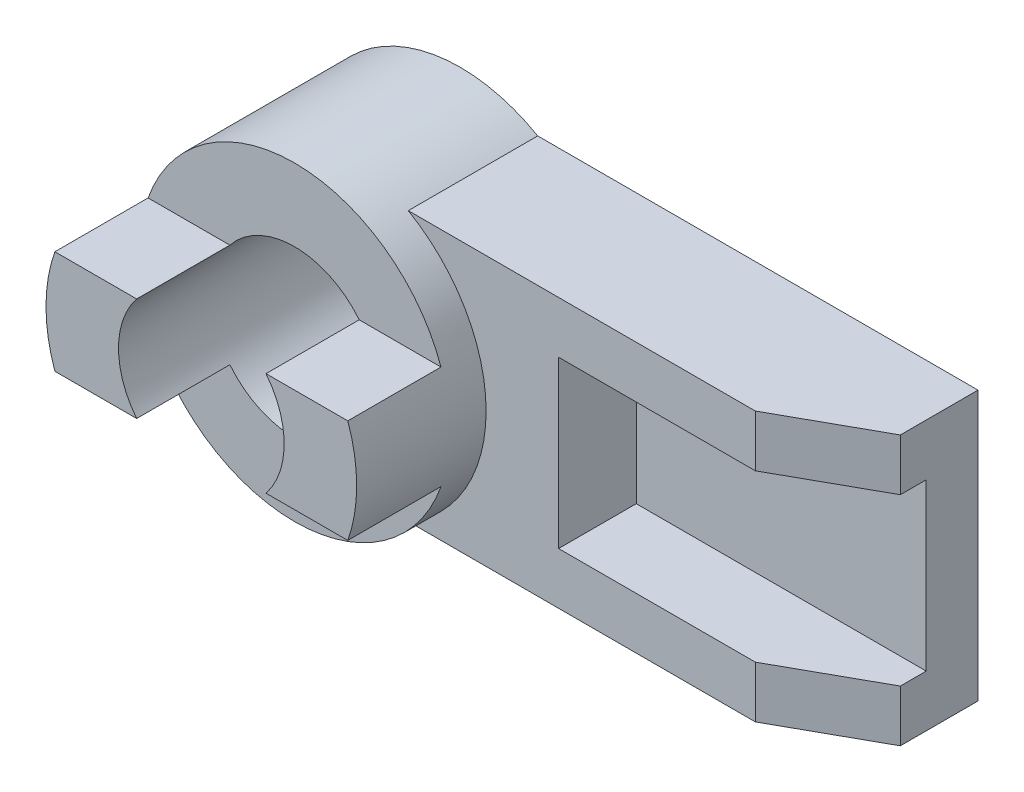
ISO-10303-21;
HEADER;
FILE_DESCRIPTION(('STEP AP214'),'2;1');
FILE_NAME('part.step','',(''),(''),'','','');
FILE_SCHEMA(('AUTOMOTIVE_DESIGN { 1 0 10303 214 1 1 1 1 }'));
ENDSEC;
DATA;
#1=APPLICATION_CONTEXT('core data for automotive mechanical design processes');
#2=APPLICATION_PROTOCOL_DEFINITION('international standard','automotive_design',2000,#1);
#3=PRODUCT_CONTEXT('',#1,'mechanical');
#4=PRODUCT('Part','Part','',(#3));
#5=PRODUCT_RELATED_PRODUCT_CATEGORY('part','',(#4));
#6=PRODUCT_DEFINITION_FORMATION('','',#4);
#7=PRODUCT_DEFINITION_CONTEXT('part definition',#1,'design');
#8=PRODUCT_DEFINITION('design','',#6,#7);
#9=PRODUCT_DEFINITION_SHAPE('','',#8);
#10=(LENGTH_UNIT() NAMED_UNIT(*) SI_UNIT(.MILLI.,.METRE.));
#11=(NAMED_UNIT(*) PLANE_ANGLE_UNIT() SI_UNIT($,.RADIAN.));
#12=(NAMED_UNIT(*) SI_UNIT($,.STERADIAN.) SOLID_ANGLE_UNIT());
#13=UNCERTAINTY_MEASURE_WITH_UNIT(LENGTH_MEASURE(1.E-05),#10,'distance_accuracy_value','');
#14=(GEOMETRIC_REPRESENTATION_CONTEXT(3) GLOBAL_UNCERTAINTY_ASSIGNED_CONTEXT((#13)) GLOBAL_UNIT_ASSIGNED_CONTEXT((#10,
#11,#12)) REPRESENTATION_CONTEXT('',''));
#15=CARTESIAN_POINT('',(0.,0.,0.));
#16=DIRECTION('',(0.,0.,1.));
#17=DIRECTION('',(1.,0.,0.));
#18=AXIS2_PLACEMENT_3D('',#15,#16,#17);
#19=CARTESIAN_POINT('',(0.,26.,50.));
#20=DIRECTION('',(0.,0.,-1.));
#21=DIRECTION('',(-1.,0.,0.));
#22=AXIS2_PLACEMENT_3D('',#19,#20,#21);
#23=PLANE('',#22);
#24=DIRECTION('',(1.,0.,0.));
#25=VECTOR('',#24,1.);
#26=CARTESIAN_POINT('',(0.,36.,50.));
#27=LINE('',#26,#25);
#28=CARTESIAN_POINT('',(12.4899959967968,36.,50.));
#29=VERTEX_POINT('',#28);
#30=CARTESIAN_POINT('',(28.2842712474619,36.,50.));
#31=VERTEX_POINT('',#30);
#32=EDGE_CURVE('E279',#29,#31,#27,.T.);
#33=ORIENTED_EDGE('',*,*,#32,.F.);
#34=CARTESIAN_POINT('',(0.,26.,50.));
#35=DIRECTION('',(0.,0.,1.));
#36=DIRECTION('',(1.,0.,0.));
#37=AXIS2_PLACEMENT_3D('',#34,#35,#36);
#38=CIRCLE('',#37,16.);
#39=CARTESIAN_POINT('',(12.4899959967968,16.,50.));
#40=VERTEX_POINT('',#39);
#41=EDGE_CURVE('E311',#40,#29,#38,.T.);
#42=ORIENTED_EDGE('',*,*,#41,.F.);
#43=DIRECTION('',(-1.,0.,0.));
#44=VECTOR('',#43,1.);
#45=CARTESIAN_POINT('',(0.,16.,50.));
#46=LINE('',#45,#44);
#47=CARTESIAN_POINT('',(28.2842712474619,16.,50.));
#48=VERTEX_POINT('',#47);
#49=EDGE_CURVE('E283',#48,#40,#46,.T.);
#50=ORIENTED_EDGE('',*,*,#49,.F.);
#51=CARTESIAN_POINT('',(0.,26.,50.));
#52=DIRECTION('',(0.,0.,-1.));
#53=DIRECTION('',(-1.,0.,0.));
#54=AXIS2_PLACEMENT_3D('',#51,#52,#53);
#55=CIRCLE('',#54,30.);
#56=EDGE_CURVE('E244',#31,#48,#55,.T.);
#57=ORIENTED_EDGE('',*,*,#56,.F.);
#58=EDGE_LOOP('',(#33,#42,#50,#57));
#59=FACE_BOUND('',#58,.T.);
#60=ADVANCED_FACE('F40',(#59),#23,.F.);
#61=CARTESIAN_POINT('',(-36.9257734325546,36.,32.));
#62=DIRECTION('',(0.,1.,0.));
#63=DIRECTION('',(0.,0.,1.));
#64=AXIS2_PLACEMENT_3D('',#61,#62,#63);
#65=PLANE('',#64);
#66=DIRECTION('',(0.,0.,1.));
#67=VECTOR('',#66,1.);
#68=CARTESIAN_POINT('',(-12.4899959967968,36.,-0.001000000000001));
#69=LINE('',#68,#67);
#70=CARTESIAN_POINT('',(-12.4899959967968,36.,50.));
#71=VERTEX_POINT('',#70);
#72=CARTESIAN_POINT('',(-12.4899959967968,36.,32.));
#73=VERTEX_POINT('',#72);
#74=EDGE_CURVE('E294',#71,#73,#69,.F.);
#75=ORIENTED_EDGE('',*,*,#74,.T.);
#76=DIRECTION('',(-1.,0.,0.));
#77=VECTOR('',#76,1.);
#78=CARTESIAN_POINT('',(-36.9257734325546,36.,32.));
#79=LINE('',#78,#77);
#80=CARTESIAN_POINT('',(-28.2842712474619,36.,32.));
#81=VERTEX_POINT('',#80);
#82=EDGE_CURVE('E296',#73,#81,#79,.T.);
#83=ORIENTED_EDGE('',*,*,#82,.T.);
#84=DIRECTION('',(0.,0.,-1.));
#85=VECTOR('',#84,1.);
#86=CARTESIAN_POINT('',(-28.2842712474619,36.,50.));
#87=LINE('',#86,#85);
#88=CARTESIAN_POINT('',(-28.2842712474619,36.,50.));
#89=VERTEX_POINT('',#88);
#90=EDGE_CURVE('E185',#89,#81,#87,.T.);
#91=ORIENTED_EDGE('',*,*,#90,.F.);
#92=EDGE_CURVE('E280',#89,#71,#27,.T.);
#93=ORIENTED_EDGE('',*,*,#92,.T.);
#94=EDGE_LOOP('',(#75,#83,#91,#93));
#95=FACE_BOUND('',#94,.T.);
#96=ADVANCED_FACE('F293',(#95),#65,.T.);
#97=CARTESIAN_POINT('',(-36.9257734325546,16.,32.));
#98=DIRECTION('',(0.,-1.,0.));
#99=DIRECTION('',(0.,0.,-1.));
#100=AXIS2_PLACEMENT_3D('',#97,#98,#99);
#101=PLANE('',#100);
#102=DIRECTION('',(0.,0.,1.));
#103=VECTOR('',#102,1.);
#104=CARTESIAN_POINT('',(12.4899959967968,16.,-0.001000000000001));
#105=LINE('',#104,#103);
#106=CARTESIAN_POINT('',(12.4899959967968,16.,32.));
#107=VERTEX_POINT('',#106);
#108=EDGE_CURVE('E171',#40,#107,#105,.F.);
#109=ORIENTED_EDGE('',*,*,#108,.T.);
#110=DIRECTION('',(1.,0.,0.));
#111=VECTOR('',#110,1.);
#112=CARTESIAN_POINT('',(-36.9257734325546,16.,32.));
#113=LINE('',#112,#111);
#114=CARTESIAN_POINT('',(28.2842712474619,16.,32.));
#115=VERTEX_POINT('',#114);
#116=EDGE_CURVE('E179',#107,#115,#113,.T.);
#117=ORIENTED_EDGE('',*,*,#116,.T.);
#118=DIRECTION('',(0.,0.,-1.));
#119=VECTOR('',#118,1.);
#120=CARTESIAN_POINT('',(28.2842712474619,16.,50.));
#121=LINE('',#120,#119);
#122=EDGE_CURVE('E63',#48,#115,#121,.T.);
#123=ORIENTED_EDGE('',*,*,#122,.F.);
#124=ORIENTED_EDGE('',*,*,#49,.T.);
#125=EDGE_LOOP('',(#109,#117,#123,#124));
#126=FACE_BOUND('',#125,.T.);
#127=ADVANCED_FACE('F318',(#126),#101,.T.);
#128=CARTESIAN_POINT('',(0.,26.,50.));
#129=DIRECTION('',(0.,0.,-1.));
#130=DIRECTION('',(-1.,0.,0.));
#131=AXIS2_PLACEMENT_3D('',#128,#129,#130);
#132=CYLINDRICAL_SURFACE('',#131,30.);
#133=DIRECTION('',(0.,0.,-1.));
#134=VECTOR('',#133,1.);
#135=CARTESIAN_POINT('',(14.9666295470958,0.,50.));
#136=LINE('',#135,#134);
#137=CARTESIAN_POINT('',(14.9666295470958,0.,25.));
#138=VERTEX_POINT('',#137);
#139=CARTESIAN_POINT('',(14.9666295470958,0.,0.));
#140=VERTEX_POINT('',#139);
#141=EDGE_CURVE('E253',#138,#140,#136,.T.);
#142=ORIENTED_EDGE('',*,*,#141,.F.);
#143=CARTESIAN_POINT('',(0.,26.,25.));
#144=DIRECTION('',(0.,0.,-1.));
#145=DIRECTION('',(-1.,0.,0.));
#146=AXIS2_PLACEMENT_3D('',#143,#144,#145);
#147=CIRCLE('',#146,30.);
#148=CARTESIAN_POINT('',(14.9666295470958,52.,25.));
#149=VERTEX_POINT('',#148);
#150=EDGE_CURVE('E247',#149,#138,#147,.T.);
#151=ORIENTED_EDGE('',*,*,#150,.F.);
#152=DIRECTION('',(0.,0.,-1.));
#153=VECTOR('',#152,1.);
#154=CARTESIAN_POINT('',(14.9666295470958,52.,50.));
#155=LINE('',#154,#153);
#156=CARTESIAN_POINT('',(14.9666295470958,52.,0.));
#157=VERTEX_POINT('',#156);
#158=EDGE_CURVE('E250',#157,#149,#155,.F.);
#159=ORIENTED_EDGE('',*,*,#158,.F.);
#160=CARTESIAN_POINT('',(0.,26.,0.));
#161=DIRECTION('',(0.,0.,-1.));
#162=DIRECTION('',(-1.,0.,0.));
#163=AXIS2_PLACEMENT_3D('',#160,#161,#162);
#164=CIRCLE('',#163,30.);
#165=EDGE_CURVE('E236',#140,#157,#164,.T.);
#166=ORIENTED_EDGE('',*,*,#165,.F.);
#167=EDGE_LOOP('',(#142,#151,#159,#166));
#168=FACE_BOUND('',#167,.T.);
#169=CARTESIAN_POINT('',(0.,26.,32.));
#170=DIRECTION('',(0.,0.,1.));
#171=DIRECTION('',(1.,0.,0.));
#172=AXIS2_PLACEMENT_3D('',#169,#170,#171);
#173=CIRCLE('',#172,30.);
#174=CARTESIAN_POINT('',(-28.2842712474619,16.,32.));
#175=VERTEX_POINT('',#174);
#176=EDGE_CURVE('E12',#115,#175,#173,.F.);
#177=ORIENTED_EDGE('',*,*,#176,.T.);
#178=DIRECTION('',(0.,0.,-1.));
#179=VECTOR('',#178,1.);
#180=CARTESIAN_POINT('',(-28.2842712474619,16.,50.));
#181=LINE('',#180,#179);
#182=CARTESIAN_POINT('',(-28.2842712474619,16.,50.));
#183=VERTEX_POINT('',#182);
#184=EDGE_CURVE('E184',#175,#183,#181,.F.);
#185=ORIENTED_EDGE('',*,*,#184,.T.);
#186=EDGE_CURVE('E241',#183,#89,#55,.T.);
#187=ORIENTED_EDGE('',*,*,#186,.T.);
#188=ORIENTED_EDGE('',*,*,#90,.T.);
#189=CARTESIAN_POINT('',(28.2842712474619,36.,32.));
#190=VERTEX_POINT('',#189);
#191=EDGE_CURVE('E44',#81,#190,#173,.F.);
#192=ORIENTED_EDGE('',*,*,#191,.T.);
#193=DIRECTION('',(0.,0.,-1.));
#194=VECTOR('',#193,1.);
#195=CARTESIAN_POINT('',(28.2842712474619,36.,50.));
#196=LINE('',#195,#194);
#197=EDGE_CURVE('E188',#190,#31,#196,.F.);
#198=ORIENTED_EDGE('',*,*,#197,.T.);
#199=ORIENTED_EDGE('',*,*,#56,.T.);
#200=ORIENTED_EDGE('',*,*,#122,.T.);
#201=EDGE_LOOP('',(#177,#185,#187,#188,#192,#198,#199,#200));
#202=FACE_BOUND('',#201,.T.);
#203=ADVANCED_FACE('F288',(#168,#202),#132,.T.);
#204=CARTESIAN_POINT('',(-12.4899959967968,16.,50.));
#205=VERTEX_POINT('',#204);
#206=EDGE_CURVE('E282',#205,#183,#46,.T.);
#207=ORIENTED_EDGE('',*,*,#206,.F.);
#208=EDGE_CURVE('E55',#71,#205,#38,.T.);
#209=ORIENTED_EDGE('',*,*,#208,.F.);
#210=ORIENTED_EDGE('',*,*,#92,.F.);
#211=ORIENTED_EDGE('',*,*,#186,.F.);
#212=EDGE_LOOP('',(#207,#209,#210,#211));
#213=FACE_BOUND('',#212,.T.);
#214=ADVANCED_FACE('F290',(#213),#23,.F.);
#215=CARTESIAN_POINT('',(100.,0.,25.));
#216=DIRECTION('',(-1.,0.,0.));
#217=DIRECTION('',(0.,0.,1.));
#218=AXIS2_PLACEMENT_3D('',#215,#216,#217);
#219=PLANE('',#218);
#220=DIRECTION('',(0.,0.,1.));
#221=VECTOR('',#220,1.);
#222=CARTESIAN_POINT('',(100.,42.,10.));
#223=LINE('',#222,#221);
#224=CARTESIAN_POINT('',(100.,42.,10.));
#225=VERTEX_POINT('',#224);
#226=CARTESIAN_POINT('',(100.,42.,15.));
#227=VERTEX_POINT('',#226);
#228=EDGE_CURVE('E222',#225,#227,#223,.T.);
#229=ORIENTED_EDGE('',*,*,#228,.F.);
#230=DIRECTION('',(0.,-1.,0.));
#231=VECTOR('',#230,1.);
#232=CARTESIAN_POINT('',(100.,42.,10.));
#233=LINE('',#232,#231);
#234=CARTESIAN_POINT('',(100.,10.,10.));
#235=VERTEX_POINT('',#234);
#236=EDGE_CURVE('E205',#225,#235,#233,.T.);
#237=ORIENTED_EDGE('',*,*,#236,.T.);
#238=DIRECTION('',(0.,0.,1.));
#239=VECTOR('',#238,1.);
#240=CARTESIAN_POINT('',(100.,10.,10.));
#241=LINE('',#240,#239);
#242=CARTESIAN_POINT('',(100.,10.,15.));
#243=VERTEX_POINT('',#242);
#244=EDGE_CURVE('E219',#235,#243,#241,.T.);
#245=ORIENTED_EDGE('',*,*,#244,.T.);
#246=DIRECTION('',(0.,1.,0.));
#247=VECTOR('',#246,1.);
#248=CARTESIAN_POINT('',(100.,-4.001,15.));
#249=LINE('',#248,#247);
#250=CARTESIAN_POINT('',(100.,0.,15.));
#251=VERTEX_POINT('',#250);
#252=EDGE_CURVE('E238',#251,#243,#249,.T.);
#253=ORIENTED_EDGE('',*,*,#252,.F.);
#254=DIRECTION('',(0.,0.,-1.));
#255=VECTOR('',#254,1.);
#256=CARTESIAN_POINT('',(100.,0.,25.));
#257=LINE('',#256,#255);
#258=CARTESIAN_POINT('',(100.,0.,0.));
#259=VERTEX_POINT('',#258);
#260=EDGE_CURVE('E272',#251,#259,#257,.T.);
#261=ORIENTED_EDGE('',*,*,#260,.T.);
#262=DIRECTION('',(0.,1.,0.));
#263=VECTOR('',#262,1.);
#264=CARTESIAN_POINT('',(100.,0.,0.));
#265=LINE('',#264,#263);
#266=CARTESIAN_POINT('',(100.,52.,0.));
#267=VERTEX_POINT('',#266);
#268=EDGE_CURVE('E266',#259,#267,#265,.T.);
#269=ORIENTED_EDGE('',*,*,#268,.T.);
#270=DIRECTION('',(0.,0.,-1.));
#271=VECTOR('',#270,1.);
#272=CARTESIAN_POINT('',(100.,52.,25.));
#273=LINE('',#272,#271);
#274=CARTESIAN_POINT('',(100.,52.,15.));
#275=VERTEX_POINT('',#274);
#276=EDGE_CURVE('E263',#275,#267,#273,.T.);
#277=ORIENTED_EDGE('',*,*,#276,.F.);
#278=EDGE_CURVE('E232',#227,#275,#249,.T.);
#279=ORIENTED_EDGE('',*,*,#278,.F.);
#280=EDGE_LOOP('',(#229,#237,#245,#253,#261,#269,#277,#279));
#281=FACE_BOUND('',#280,.T.);
#282=ADVANCED_FACE('F343',(#281),#219,.F.);
#283=CARTESIAN_POINT('',(0.,0.,25.));
#284=DIRECTION('',(0.,0.,-1.));
#285=DIRECTION('',(-1.,0.,0.));
#286=AXIS2_PLACEMENT_3D('',#283,#284,#285);
#287=PLANE('',#286);
#288=DIRECTION('',(1.,0.,0.));
#289=VECTOR('',#288,1.);
#290=CARTESIAN_POINT('',(44.,42.,25.));
#291=LINE('',#290,#289);
#292=CARTESIAN_POINT('',(44.,42.,25.));
#293=VERTEX_POINT('',#292);
#294=CARTESIAN_POINT('',(82.,42.,25.));
#295=VERTEX_POINT('',#294);
#296=EDGE_CURVE('E214',#293,#295,#291,.T.);
#297=ORIENTED_EDGE('',*,*,#296,.T.);
#298=DIRECTION('',(0.,1.,0.));
#299=VECTOR('',#298,1.);
#300=CARTESIAN_POINT('',(82.,-4.001,25.));
#301=LINE('',#300,#299);
#302=CARTESIAN_POINT('',(82.,52.,25.));
#303=VERTEX_POINT('',#302);
#304=EDGE_CURVE('E237',#295,#303,#301,.T.);
#305=ORIENTED_EDGE('',*,*,#304,.T.);
#306=DIRECTION('',(-1.,0.,0.));
#307=VECTOR('',#306,1.);
#308=CARTESIAN_POINT('',(0.,52.,25.));
#309=LINE('',#308,#307);
#310=EDGE_CURVE('E260',#303,#149,#309,.T.);
#311=ORIENTED_EDGE('',*,*,#310,.T.);
#312=ORIENTED_EDGE('',*,*,#150,.T.);
#313=DIRECTION('',(1.,0.,0.));
#314=VECTOR('',#313,1.);
#315=CARTESIAN_POINT('',(0.,0.,25.));
#316=LINE('',#315,#314);
#317=CARTESIAN_POINT('',(82.,0.,25.));
#318=VERTEX_POINT('',#317);
#319=EDGE_CURVE('E257',#138,#318,#316,.T.);
#320=ORIENTED_EDGE('',*,*,#319,.T.);
#321=CARTESIAN_POINT('',(82.,10.,25.));
#322=VERTEX_POINT('',#321);
#323=EDGE_CURVE('E233',#318,#322,#301,.T.);
#324=ORIENTED_EDGE('',*,*,#323,.T.);
#325=DIRECTION('',(1.,0.,0.));
#326=VECTOR('',#325,1.);
#327=CARTESIAN_POINT('',(44.,10.,25.));
#328=LINE('',#327,#326);
#329=CARTESIAN_POINT('',(44.,10.,25.));
#330=VERTEX_POINT('',#329);
#331=EDGE_CURVE('E203',#330,#322,#328,.T.);
#332=ORIENTED_EDGE('',*,*,#331,.F.);
#333=DIRECTION('',(0.,1.,0.));
#334=VECTOR('',#333,1.);
#335=CARTESIAN_POINT('',(44.,10.,25.));
#336=LINE('',#335,#334);
#337=EDGE_CURVE('E198',#330,#293,#336,.T.);
#338=ORIENTED_EDGE('',*,*,#337,.T.);
#339=EDGE_LOOP('',(#297,#305,#311,#312,#320,#324,#332,#338));
#340=FACE_BOUND('',#339,.T.);
#341=ADVANCED_FACE('F348',(#340),#287,.F.);
#342=CARTESIAN_POINT('',(100.,-4.001,15.));
#343=DIRECTION('',(-0.485642931178632,0.,-0.874157276121538));
#344=DIRECTION('',(-0.874157276121538,0.,0.485642931178632));
#345=AXIS2_PLACEMENT_3D('',#342,#343,#344);
#346=PLANE('',#345);
#347=DIRECTION('',(-0.874157276121538,0.,0.485642931178632));
#348=VECTOR('',#347,1.);
#349=CARTESIAN_POINT('',(100.,42.,15.));
#350=LINE('',#349,#348);
#351=EDGE_CURVE('E277',#227,#295,#350,.T.);
#352=ORIENTED_EDGE('',*,*,#351,.F.);
#353=ORIENTED_EDGE('',*,*,#278,.T.);
#354=DIRECTION('',(-0.874157276121538,0.,0.485642931178632));
#355=VECTOR('',#354,1.);
#356=CARTESIAN_POINT('',(100.,52.,15.));
#357=LINE('',#356,#355);
#358=EDGE_CURVE('E229',#275,#303,#357,.T.);
#359=ORIENTED_EDGE('',*,*,#358,.T.);
#360=ORIENTED_EDGE('',*,*,#304,.F.);
#361=EDGE_LOOP('',(#352,#353,#359,#360));
#362=FACE_BOUND('',#361,.T.);
#363=ADVANCED_FACE('F357',(#362),#346,.F.);
#364=CARTESIAN_POINT('',(0.,0.,25.));
#365=DIRECTION('',(0.,1.,0.));
#366=DIRECTION('',(0.,0.,1.));
#367=AXIS2_PLACEMENT_3D('',#364,#365,#366);
#368=PLANE('',#367);
#369=ORIENTED_EDGE('',*,*,#260,.F.);
#370=DIRECTION('',(0.874157276121538,0.,-0.485642931178632));
#371=VECTOR('',#370,1.);
#372=CARTESIAN_POINT('',(100.,0.,15.));
#373=LINE('',#372,#371);
#374=EDGE_CURVE('E227',#318,#251,#373,.T.);
#375=ORIENTED_EDGE('',*,*,#374,.F.);
#376=ORIENTED_EDGE('',*,*,#319,.F.);
#377=ORIENTED_EDGE('',*,*,#141,.T.);
#378=DIRECTION('',(1.,0.,0.));
#379=VECTOR('',#378,1.);
#380=CARTESIAN_POINT('',(0.,0.,0.));
#381=LINE('',#380,#379);
#382=EDGE_CURVE('E256',#140,#259,#381,.T.);
#383=ORIENTED_EDGE('',*,*,#382,.T.);
#384=EDGE_LOOP('',(#369,#375,#376,#377,#383));
#385=FACE_BOUND('',#384,.T.);
#386=ADVANCED_FACE('F42',(#385),#368,.F.);
#387=CARTESIAN_POINT('',(0.,52.,25.));
#388=DIRECTION('',(0.,-1.,0.));
#389=DIRECTION('',(0.,0.,-1.));
#390=AXIS2_PLACEMENT_3D('',#387,#388,#389);
#391=PLANE('',#390);
#392=ORIENTED_EDGE('',*,*,#310,.F.);
#393=ORIENTED_EDGE('',*,*,#358,.F.);
#394=ORIENTED_EDGE('',*,*,#276,.T.);
#395=DIRECTION('',(-1.,0.,0.));
#396=VECTOR('',#395,1.);
#397=CARTESIAN_POINT('',(0.,52.,0.));
#398=LINE('',#397,#396);
#399=EDGE_CURVE('E261',#267,#157,#398,.T.);
#400=ORIENTED_EDGE('',*,*,#399,.T.);
#401=ORIENTED_EDGE('',*,*,#158,.T.);
#402=EDGE_LOOP('',(#392,#393,#394,#400,#401));
#403=FACE_BOUND('',#402,.T.);
#404=ADVANCED_FACE('F363',(#403),#391,.F.);
#405=CARTESIAN_POINT('',(0.,0.,0.));
#406=DIRECTION('',(0.,0.,-1.));
#407=DIRECTION('',(-1.,0.,0.));
#408=AXIS2_PLACEMENT_3D('',#405,#406,#407);
#409=PLANE('',#408);
#410=CARTESIAN_POINT('',(0.,26.,0.));
#411=DIRECTION('',(0.,0.,-1.));
#412=DIRECTION('',(-1.,0.,0.));
#413=AXIS2_PLACEMENT_3D('',#410,#411,#412);
#414=CIRCLE('',#413,16.);
#415=CARTESIAN_POINT('',(-16.,26.,0.));
#416=VERTEX_POINT('',#415);
#417=EDGE_CURVE('E309',#416,#416,#414,.F.);
#418=ORIENTED_EDGE('',*,*,#417,.T.);
#419=EDGE_LOOP('',(#418));
#420=FACE_BOUND('',#419,.T.);
#421=ORIENTED_EDGE('',*,*,#382,.F.);
#422=ORIENTED_EDGE('',*,*,#165,.T.);
#423=ORIENTED_EDGE('',*,*,#399,.F.);
#424=ORIENTED_EDGE('',*,*,#268,.F.);
#425=EDGE_LOOP('',(#421,#422,#423,#424));
#426=FACE_BOUND('',#425,.T.);
#427=ADVANCED_FACE('F359',(#420,#426),#409,.T.);
#428=ORIENTED_EDGE('',*,*,#252,.T.);
#429=DIRECTION('',(-0.874157276121538,0.,0.485642931178632));
#430=VECTOR('',#429,1.);
#431=CARTESIAN_POINT('',(100.,10.,15.));
#432=LINE('',#431,#430);
#433=EDGE_CURVE('E274',#243,#322,#432,.T.);
#434=ORIENTED_EDGE('',*,*,#433,.T.);
#435=ORIENTED_EDGE('',*,*,#323,.F.);
#436=ORIENTED_EDGE('',*,*,#374,.T.);
#437=EDGE_LOOP('',(#428,#434,#435,#436));
#438=FACE_BOUND('',#437,.T.);
#439=ADVANCED_FACE('F362',(#438),#346,.F.);
#440=CARTESIAN_POINT('',(44.,42.,10.));
#441=DIRECTION('',(0.,-1.,0.));
#442=DIRECTION('',(0.,0.,-1.));
#443=AXIS2_PLACEMENT_3D('',#440,#441,#442);
#444=PLANE('',#443);
#445=ORIENTED_EDGE('',*,*,#351,.T.);
#446=ORIENTED_EDGE('',*,*,#296,.F.);
#447=DIRECTION('',(0.,0.,1.));
#448=VECTOR('',#447,1.);
#449=CARTESIAN_POINT('',(44.,42.,10.));
#450=LINE('',#449,#448);
#451=CARTESIAN_POINT('',(44.,42.,10.));
#452=VERTEX_POINT('',#451);
#453=EDGE_CURVE('E224',#452,#293,#450,.T.);
#454=ORIENTED_EDGE('',*,*,#453,.F.);
#455=DIRECTION('',(1.,0.,0.));
#456=VECTOR('',#455,1.);
#457=CARTESIAN_POINT('',(44.,42.,10.));
#458=LINE('',#457,#456);
#459=EDGE_CURVE('E202',#452,#225,#458,.T.);
#460=ORIENTED_EDGE('',*,*,#459,.T.);
#461=ORIENTED_EDGE('',*,*,#228,.T.);
#462=EDGE_LOOP('',(#445,#446,#454,#460,#461));
#463=FACE_BOUND('',#462,.T.);
#464=ADVANCED_FACE('F398',(#463),#444,.T.);
#465=CARTESIAN_POINT('',(44.,10.,10.));
#466=DIRECTION('',(0.,-1.,0.));
#467=DIRECTION('',(0.,0.,-1.));
#468=AXIS2_PLACEMENT_3D('',#465,#466,#467);
#469=PLANE('',#468);
#470=ORIENTED_EDGE('',*,*,#244,.F.);
#471=DIRECTION('',(1.,0.,0.));
#472=VECTOR('',#471,1.);
#473=CARTESIAN_POINT('',(44.,10.,10.));
#474=LINE('',#473,#472);
#475=CARTESIAN_POINT('',(44.,10.,10.));
#476=VERTEX_POINT('',#475);
#477=EDGE_CURVE('E208',#476,#235,#474,.T.);
#478=ORIENTED_EDGE('',*,*,#477,.F.);
#479=DIRECTION('',(0.,0.,1.));
#480=VECTOR('',#479,1.);
#481=CARTESIAN_POINT('',(44.,10.,10.));
#482=LINE('',#481,#480);
#483=EDGE_CURVE('E211',#476,#330,#482,.T.);
#484=ORIENTED_EDGE('',*,*,#483,.T.);
#485=ORIENTED_EDGE('',*,*,#331,.T.);
#486=ORIENTED_EDGE('',*,*,#433,.F.);
#487=EDGE_LOOP('',(#470,#478,#484,#485,#486));
#488=FACE_BOUND('',#487,.T.);
#489=ADVANCED_FACE('F388',(#488),#469,.F.);
#490=CARTESIAN_POINT('',(44.,10.,10.));
#491=DIRECTION('',(1.,0.,0.));
#492=DIRECTION('',(0.,0.,-1.));
#493=AXIS2_PLACEMENT_3D('',#490,#491,#492);
#494=PLANE('',#493);
#495=ORIENTED_EDGE('',*,*,#337,.F.);
#496=ORIENTED_EDGE('',*,*,#483,.F.);
#497=DIRECTION('',(0.,1.,0.));
#498=VECTOR('',#497,1.);
#499=CARTESIAN_POINT('',(44.,10.,10.));
#500=LINE('',#499,#498);
#501=EDGE_CURVE('E199',#476,#452,#500,.T.);
#502=ORIENTED_EDGE('',*,*,#501,.T.);
#503=ORIENTED_EDGE('',*,*,#453,.T.);
#504=EDGE_LOOP('',(#495,#496,#502,#503));
#505=FACE_BOUND('',#504,.T.);
#506=ADVANCED_FACE('F331',(#505),#494,.T.);
#507=CARTESIAN_POINT('',(0.,0.,10.));
#508=DIRECTION('',(0.,0.,-1.));
#509=DIRECTION('',(-1.,0.,0.));
#510=AXIS2_PLACEMENT_3D('',#507,#508,#509);
#511=PLANE('',#510);
#512=ORIENTED_EDGE('',*,*,#501,.F.);
#513=ORIENTED_EDGE('',*,*,#477,.T.);
#514=ORIENTED_EDGE('',*,*,#236,.F.);
#515=ORIENTED_EDGE('',*,*,#459,.F.);
#516=EDGE_LOOP('',(#512,#513,#514,#515));
#517=FACE_BOUND('',#516,.T.);
#518=ADVANCED_FACE('F324',(#517),#511,.F.);
#519=DIRECTION('',(0.,0.,1.));
#520=VECTOR('',#519,1.);
#521=CARTESIAN_POINT('',(12.4899959967968,36.,-0.001000000000001));
#522=LINE('',#521,#520);
#523=CARTESIAN_POINT('',(12.4899959967968,36.,32.));
#524=VERTEX_POINT('',#523);
#525=EDGE_CURVE('E314',#524,#29,#522,.T.);
#526=ORIENTED_EDGE('',*,*,#525,.T.);
#527=ORIENTED_EDGE('',*,*,#32,.T.);
#528=ORIENTED_EDGE('',*,*,#197,.F.);
#529=EDGE_CURVE('E190',#190,#524,#79,.T.);
#530=ORIENTED_EDGE('',*,*,#529,.T.);
#531=EDGE_LOOP('',(#526,#527,#528,#530));
#532=FACE_BOUND('',#531,.T.);
#533=ADVANCED_FACE('F322',(#532),#65,.T.);
#534=CARTESIAN_POINT('',(31.5371132837227,26.,32.));
#535=DIRECTION('',(0.,0.,1.));
#536=DIRECTION('',(1.,0.,0.));
#537=AXIS2_PLACEMENT_3D('',#534,#535,#536);
#538=PLANE('',#537);
#539=CARTESIAN_POINT('',(0.,26.,32.));
#540=DIRECTION('',(0.,0.,1.));
#541=DIRECTION('',(1.,0.,0.));
#542=AXIS2_PLACEMENT_3D('',#539,#540,#541);
#543=CIRCLE('',#542,16.);
#544=EDGE_CURVE('E180',#73,#524,#543,.F.);
#545=ORIENTED_EDGE('',*,*,#544,.T.);
#546=ORIENTED_EDGE('',*,*,#529,.F.);
#547=ORIENTED_EDGE('',*,*,#191,.F.);
#548=ORIENTED_EDGE('',*,*,#82,.F.);
#549=EDGE_LOOP('',(#545,#546,#547,#548));
#550=FACE_BOUND('',#549,.T.);
#551=ADVANCED_FACE('F303',(#550),#538,.T.);
#552=CARTESIAN_POINT('',(0.,26.,32.));
#553=DIRECTION('',(0.,0.,1.));
#554=DIRECTION('',(1.,0.,0.));
#555=AXIS2_PLACEMENT_3D('',#552,#553,#554);
#556=CIRCLE('',#555,16.);
#557=CARTESIAN_POINT('',(-12.4899959967968,16.,32.));
#558=VERTEX_POINT('',#557);
#559=EDGE_CURVE('E166',#107,#558,#556,.F.);
#560=ORIENTED_EDGE('',*,*,#559,.T.);
#561=EDGE_CURVE('E178',#175,#558,#113,.T.);
#562=ORIENTED_EDGE('',*,*,#561,.F.);
#563=ORIENTED_EDGE('',*,*,#176,.F.);
#564=ORIENTED_EDGE('',*,*,#116,.F.);
#565=EDGE_LOOP('',(#560,#562,#563,#564));
#566=FACE_BOUND('',#565,.T.);
#567=ADVANCED_FACE('F176',(#566),#538,.T.);
#568=DIRECTION('',(0.,0.,1.));
#569=VECTOR('',#568,1.);
#570=CARTESIAN_POINT('',(-12.4899959967968,16.,-0.001000000000001));
#571=LINE('',#570,#569);
#572=EDGE_CURVE('E163',#558,#205,#571,.T.);
#573=ORIENTED_EDGE('',*,*,#572,.T.);
#574=ORIENTED_EDGE('',*,*,#206,.T.);
#575=ORIENTED_EDGE('',*,*,#184,.F.);
#576=ORIENTED_EDGE('',*,*,#561,.T.);
#577=EDGE_LOOP('',(#573,#574,#575,#576));
#578=FACE_BOUND('',#577,.T.);
#579=ADVANCED_FACE('F182',(#578),#101,.T.);
#580=CARTESIAN_POINT('',(0.,26.,-0.001000000000001));
#581=DIRECTION('',(0.,0.,1.));
#582=DIRECTION('',(1.,0.,0.));
#583=AXIS2_PLACEMENT_3D('',#580,#581,#582);
#584=CYLINDRICAL_SURFACE('',#583,16.);
#585=ORIENTED_EDGE('',*,*,#417,.F.);
#586=EDGE_LOOP('',(#585));
#587=FACE_BOUND('',#586,.T.);
#588=ORIENTED_EDGE('',*,*,#208,.T.);
#589=ORIENTED_EDGE('',*,*,#572,.F.);
#590=ORIENTED_EDGE('',*,*,#559,.F.);
#591=ORIENTED_EDGE('',*,*,#108,.F.);
#592=ORIENTED_EDGE('',*,*,#41,.T.);
#593=ORIENTED_EDGE('',*,*,#525,.F.);
#594=ORIENTED_EDGE('',*,*,#544,.F.);
#595=ORIENTED_EDGE('',*,*,#74,.F.);
#596=EDGE_LOOP('',(#588,#589,#590,#591,#592,#593,#594,#595));
#597=FACE_BOUND('',#596,.T.);
#598=ADVANCED_FACE('F165',(#587,#597),#584,.F.);
#599=CLOSED_SHELL('',(#60,#96,#127,#203,#214,#282,#341,#363,#386,#404,#427,#439,#464,#489,#506,
#518,#533,#551,#567,#579,#598));
#600=MANIFOLD_SOLID_BREP('B2',#599);
#601=ADVANCED_BREP_SHAPE_REPRESENTATION('',(#18,#600),#14);
#602=SHAPE_DEFINITION_REPRESENTATION(#9,#601);
ENDSEC;
END-ISO-10303-21;
